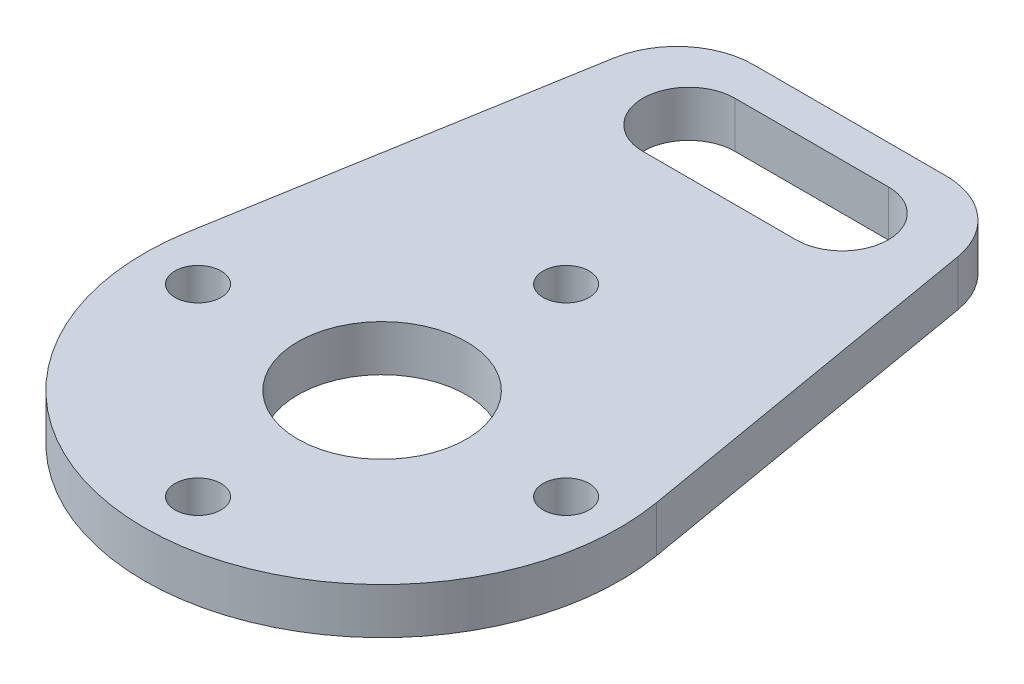
ISO-10303-21;
HEADER;
FILE_DESCRIPTION(('STEP AP214'),'2;1');
FILE_NAME('part.step','',(''),(''),'','','');
FILE_SCHEMA(('AUTOMOTIVE_DESIGN { 1 0 10303 214 1 1 1 1 }'));
ENDSEC;
DATA;
#1=APPLICATION_CONTEXT('core data for automotive mechanical design processes');
#2=APPLICATION_PROTOCOL_DEFINITION('international standard','automotive_design',2000,#1);
#3=PRODUCT_CONTEXT('',#1,'mechanical');
#4=PRODUCT('Part','Part','',(#3));
#5=PRODUCT_RELATED_PRODUCT_CATEGORY('part','',(#4));
#6=PRODUCT_DEFINITION_FORMATION('','',#4);
#7=PRODUCT_DEFINITION_CONTEXT('part definition',#1,'design');
#8=PRODUCT_DEFINITION('design','',#6,#7);
#9=PRODUCT_DEFINITION_SHAPE('','',#8);
#10=(LENGTH_UNIT() NAMED_UNIT(*) SI_UNIT(.MILLI.,.METRE.));
#11=(NAMED_UNIT(*) PLANE_ANGLE_UNIT() SI_UNIT($,.RADIAN.));
#12=(NAMED_UNIT(*) SI_UNIT($,.STERADIAN.) SOLID_ANGLE_UNIT());
#13=UNCERTAINTY_MEASURE_WITH_UNIT(LENGTH_MEASURE(1.E-05),#10,'distance_accuracy_value','');
#14=(GEOMETRIC_REPRESENTATION_CONTEXT(3) GLOBAL_UNCERTAINTY_ASSIGNED_CONTEXT((#13)) GLOBAL_UNIT_ASSIGNED_CONTEXT((#10,
#11,#12)) REPRESENTATION_CONTEXT('',''));
#15=CARTESIAN_POINT('',(0.,0.,0.));
#16=DIRECTION('',(0.,0.,1.));
#17=DIRECTION('',(1.,0.,0.));
#18=AXIS2_PLACEMENT_3D('',#15,#16,#17);
#19=CARTESIAN_POINT('',(0.,-3.,0.));
#20=DIRECTION('',(0.,1.,0.));
#21=DIRECTION('',(0.,0.,1.));
#22=AXIS2_PLACEMENT_3D('',#19,#20,#21);
#23=CYLINDRICAL_SURFACE('',#22,31.);
#24=CARTESIAN_POINT('',(0.,3.,0.));
#25=DIRECTION('',(0.,1.,0.));
#26=DIRECTION('',(0.,0.,1.));
#27=AXIS2_PLACEMENT_3D('',#24,#25,#26);
#28=CIRCLE('',#27,31.);
#29=CARTESIAN_POINT('',(-30.5547397378293,3.,-5.23525353287844));
#30=VERTEX_POINT('',#29);
#31=CARTESIAN_POINT('',(30.5547397378293,3.,-5.23525353287844));
#32=VERTEX_POINT('',#31);
#33=EDGE_CURVE('E224',#30,#32,#28,.T.);
#34=ORIENTED_EDGE('',*,*,#33,.F.);
#35=DIRECTION('',(0.,1.,0.));
#36=VECTOR('',#35,1.);
#37=CARTESIAN_POINT('',(-30.5547397378293,-3.,-5.23525353287844));
#38=LINE('',#37,#36);
#39=CARTESIAN_POINT('',(-30.5547397378293,-3.,-5.23525353287844));
#40=VERTEX_POINT('',#39);
#41=EDGE_CURVE('E375',#40,#30,#38,.T.);
#42=ORIENTED_EDGE('',*,*,#41,.F.);
#43=CARTESIAN_POINT('',(0.,-3.,0.));
#44=DIRECTION('',(0.,1.,0.));
#45=DIRECTION('',(0.,0.,1.));
#46=AXIS2_PLACEMENT_3D('',#43,#44,#45);
#47=CIRCLE('',#46,31.);
#48=CARTESIAN_POINT('',(30.5547397378293,-3.,-5.23525353287844));
#49=VERTEX_POINT('',#48);
#50=EDGE_CURVE('E210',#40,#49,#47,.T.);
#51=ORIENTED_EDGE('',*,*,#50,.T.);
#52=DIRECTION('',(0.,1.,0.));
#53=VECTOR('',#52,1.);
#54=CARTESIAN_POINT('',(30.5547397378293,-3.,-5.23525353287844));
#55=LINE('',#54,#53);
#56=EDGE_CURVE('E367',#49,#32,#55,.T.);
#57=ORIENTED_EDGE('',*,*,#56,.T.);
#58=EDGE_LOOP('',(#34,#42,#51,#57));
#59=FACE_BOUND('',#58,.T.);
#60=ADVANCED_FACE('F54',(#59),#23,.T.);
#61=CARTESIAN_POINT('',(-21.,-3.,-61.));
#62=DIRECTION('',(-0.985636765736428,0.,-0.168879146221885));
#63=DIRECTION('',(-0.168879146221885,0.,0.985636765736429));
#64=AXIS2_PLACEMENT_3D('',#61,#62,#63);
#65=PLANE('',#64);
#66=DIRECTION('',(-0.168879146221885,0.,0.985636765736429));
#67=VECTOR('',#66,1.);
#68=CARTESIAN_POINT('',(-21.,3.,-61.));
#69=LINE('',#68,#67);
#70=CARTESIAN_POINT('',(-22.4240436748357,3.,-52.6887914622188));
#71=VERTEX_POINT('',#70);
#72=EDGE_CURVE('E232',#71,#30,#69,.T.);
#73=ORIENTED_EDGE('',*,*,#72,.F.);
#74=DIRECTION('',(0.,1.,0.));
#75=VECTOR('',#74,1.);
#76=CARTESIAN_POINT('',(-22.4240436748357,-3.,-52.6887914622188));
#77=LINE('',#76,#75);
#78=CARTESIAN_POINT('',(-22.4240436748357,-3.,-52.6887914622188));
#79=VERTEX_POINT('',#78);
#80=EDGE_CURVE('E12',#71,#79,#77,.F.);
#81=ORIENTED_EDGE('',*,*,#80,.T.);
#82=DIRECTION('',(-0.168879146221885,0.,0.985636765736429));
#83=VECTOR('',#82,1.);
#84=CARTESIAN_POINT('',(-21.,-3.,-61.));
#85=LINE('',#84,#83);
#86=EDGE_CURVE('E362',#79,#40,#85,.T.);
#87=ORIENTED_EDGE('',*,*,#86,.T.);
#88=ORIENTED_EDGE('',*,*,#41,.T.);
#89=EDGE_LOOP('',(#73,#81,#87,#88));
#90=FACE_BOUND('',#89,.T.);
#91=ADVANCED_FACE('F312',(#90),#65,.T.);
#92=CARTESIAN_POINT('',(-21.,-3.,-61.));
#93=DIRECTION('',(0.,0.,-1.));
#94=DIRECTION('',(-1.,0.,0.));
#95=AXIS2_PLACEMENT_3D('',#92,#93,#94);
#96=PLANE('',#95);
#97=DIRECTION('',(-1.,0.,0.));
#98=VECTOR('',#97,1.);
#99=CARTESIAN_POINT('',(-21.,3.,-61.));
#100=LINE('',#99,#98);
#101=CARTESIAN_POINT('',(12.5676760174714,3.,-61.));
#102=VERTEX_POINT('',#101);
#103=CARTESIAN_POINT('',(-12.5676760174715,3.,-61.));
#104=VERTEX_POINT('',#103);
#105=EDGE_CURVE('E223',#102,#104,#100,.T.);
#106=ORIENTED_EDGE('',*,*,#105,.F.);
#107=DIRECTION('',(0.,1.,0.));
#108=VECTOR('',#107,1.);
#109=CARTESIAN_POINT('',(12.5676760174715,-3.,-61.));
#110=LINE('',#109,#108);
#111=CARTESIAN_POINT('',(12.5676760174714,-3.,-61.));
#112=VERTEX_POINT('',#111);
#113=EDGE_CURVE('E340',#102,#112,#110,.F.);
#114=ORIENTED_EDGE('',*,*,#113,.T.);
#115=DIRECTION('',(-1.,0.,0.));
#116=VECTOR('',#115,1.);
#117=CARTESIAN_POINT('',(-21.,-3.,-61.));
#118=LINE('',#117,#116);
#119=CARTESIAN_POINT('',(-12.5676760174715,-3.,-61.));
#120=VERTEX_POINT('',#119);
#121=EDGE_CURVE('E360',#112,#120,#118,.T.);
#122=ORIENTED_EDGE('',*,*,#121,.T.);
#123=DIRECTION('',(0.,1.,0.));
#124=VECTOR('',#123,1.);
#125=CARTESIAN_POINT('',(-12.5676760174715,-3.,-61.));
#126=LINE('',#125,#124);
#127=EDGE_CURVE('E349',#120,#104,#126,.T.);
#128=ORIENTED_EDGE('',*,*,#127,.T.);
#129=EDGE_LOOP('',(#106,#114,#122,#128));
#130=FACE_BOUND('',#129,.T.);
#131=ADVANCED_FACE('F319',(#130),#96,.T.);
#132=CARTESIAN_POINT('',(21.,-3.,-61.));
#133=DIRECTION('',(0.985636765736428,0.,-0.168879146221885));
#134=DIRECTION('',(-0.168879146221885,0.,-0.985636765736429));
#135=AXIS2_PLACEMENT_3D('',#132,#133,#134);
#136=PLANE('',#135);
#137=DIRECTION('',(-0.168879146221885,0.,-0.985636765736429));
#138=VECTOR('',#137,1.);
#139=CARTESIAN_POINT('',(21.,-3.,-61.));
#140=LINE('',#139,#138);
#141=CARTESIAN_POINT('',(22.4240436748357,-3.,-52.6887914622188));
#142=VERTEX_POINT('',#141);
#143=EDGE_CURVE('E363',#49,#142,#140,.T.);
#144=ORIENTED_EDGE('',*,*,#143,.T.);
#145=DIRECTION('',(0.,1.,0.));
#146=VECTOR('',#145,1.);
#147=CARTESIAN_POINT('',(22.4240436748357,-3.,-52.6887914622188));
#148=LINE('',#147,#146);
#149=CARTESIAN_POINT('',(22.4240436748357,3.,-52.6887914622188));
#150=VERTEX_POINT('',#149);
#151=EDGE_CURVE('E245',#142,#150,#148,.T.);
#152=ORIENTED_EDGE('',*,*,#151,.T.);
#153=DIRECTION('',(-0.168879146221885,0.,-0.985636765736429));
#154=VECTOR('',#153,1.);
#155=CARTESIAN_POINT('',(21.,3.,-61.));
#156=LINE('',#155,#154);
#157=EDGE_CURVE('E218',#32,#150,#156,.T.);
#158=ORIENTED_EDGE('',*,*,#157,.F.);
#159=ORIENTED_EDGE('',*,*,#56,.F.);
#160=EDGE_LOOP('',(#144,#152,#158,#159));
#161=FACE_BOUND('',#160,.T.);
#162=ADVANCED_FACE('F323',(#161),#136,.T.);
#163=CARTESIAN_POINT('',(0.,-3.,0.));
#164=DIRECTION('',(0.,1.,0.));
#165=DIRECTION('',(0.,0.,1.));
#166=AXIS2_PLACEMENT_3D('',#163,#164,#165);
#167=PLANE('',#166);
#168=CARTESIAN_POINT('',(0.,-3.,-24.));
#169=DIRECTION('',(0.,1.,0.));
#170=DIRECTION('',(0.,0.,1.));
#171=AXIS2_PLACEMENT_3D('',#168,#169,#170);
#172=CIRCLE('',#171,2.99999999999998);
#173=CARTESIAN_POINT('',(0.,-3.,-21.));
#174=VERTEX_POINT('',#173);
#175=EDGE_CURVE('E261',#174,#174,#172,.T.);
#176=ORIENTED_EDGE('',*,*,#175,.T.);
#177=EDGE_LOOP('',(#176));
#178=FACE_BOUND('',#177,.T.);
#179=CARTESIAN_POINT('',(24.,-3.,0.));
#180=DIRECTION('',(0.,1.,0.));
#181=DIRECTION('',(0.,0.,1.));
#182=AXIS2_PLACEMENT_3D('',#179,#180,#181);
#183=CIRCLE('',#182,2.99999999999998);
#184=CARTESIAN_POINT('',(24.,-3.,2.99999999999998));
#185=VERTEX_POINT('',#184);
#186=EDGE_CURVE('E272',#185,#185,#183,.T.);
#187=ORIENTED_EDGE('',*,*,#186,.T.);
#188=EDGE_LOOP('',(#187));
#189=FACE_BOUND('',#188,.T.);
#190=CARTESIAN_POINT('',(0.,-3.,24.));
#191=DIRECTION('',(0.,1.,0.));
#192=DIRECTION('',(0.,0.,1.));
#193=AXIS2_PLACEMENT_3D('',#190,#191,#192);
#194=CIRCLE('',#193,2.99999999999998);
#195=CARTESIAN_POINT('',(0.,-3.,27.));
#196=VERTEX_POINT('',#195);
#197=EDGE_CURVE('E281',#196,#196,#194,.T.);
#198=ORIENTED_EDGE('',*,*,#197,.T.);
#199=EDGE_LOOP('',(#198));
#200=FACE_BOUND('',#199,.T.);
#201=CARTESIAN_POINT('',(-24.,-3.,0.));
#202=DIRECTION('',(0.,1.,0.));
#203=DIRECTION('',(0.,0.,1.));
#204=AXIS2_PLACEMENT_3D('',#201,#202,#203);
#205=CIRCLE('',#204,2.99999999999998);
#206=CARTESIAN_POINT('',(-24.,-3.,2.99999999999998));
#207=VERTEX_POINT('',#206);
#208=EDGE_CURVE('E167',#207,#207,#205,.T.);
#209=ORIENTED_EDGE('',*,*,#208,.T.);
#210=EDGE_LOOP('',(#209));
#211=FACE_BOUND('',#210,.T.);
#212=DIRECTION('',(-1.,0.,0.));
#213=VECTOR('',#212,1.);
#214=CARTESIAN_POINT('',(-10.,-3.,-56.));
#215=LINE('',#214,#213);
#216=CARTESIAN_POINT('',(10.,-3.,-56.));
#217=VERTEX_POINT('',#216);
#218=CARTESIAN_POINT('',(-10.,-3.,-56.));
#219=VERTEX_POINT('',#218);
#220=EDGE_CURVE('E145',#217,#219,#215,.T.);
#221=ORIENTED_EDGE('',*,*,#220,.T.);
#222=CARTESIAN_POINT('',(-10.,-3.,-50.));
#223=DIRECTION('',(0.,1.,0.));
#224=DIRECTION('',(0.,0.,1.));
#225=AXIS2_PLACEMENT_3D('',#222,#223,#224);
#226=CIRCLE('',#225,5.99999999999999);
#227=CARTESIAN_POINT('',(-10.,-3.,-44.));
#228=VERTEX_POINT('',#227);
#229=EDGE_CURVE('E136',#219,#228,#226,.T.);
#230=ORIENTED_EDGE('',*,*,#229,.T.);
#231=DIRECTION('',(1.,0.,0.));
#232=VECTOR('',#231,1.);
#233=CARTESIAN_POINT('',(-10.,-3.,-44.));
#234=LINE('',#233,#232);
#235=CARTESIAN_POINT('',(10.,-3.,-44.));
#236=VERTEX_POINT('',#235);
#237=EDGE_CURVE('E149',#228,#236,#234,.T.);
#238=ORIENTED_EDGE('',*,*,#237,.T.);
#239=CARTESIAN_POINT('',(10.,-3.,-50.));
#240=DIRECTION('',(0.,1.,0.));
#241=DIRECTION('',(0.,0.,1.));
#242=AXIS2_PLACEMENT_3D('',#239,#240,#241);
#243=CIRCLE('',#242,5.99999999999999);
#244=EDGE_CURVE('E154',#236,#217,#243,.T.);
#245=ORIENTED_EDGE('',*,*,#244,.T.);
#246=EDGE_LOOP('',(#221,#230,#238,#245));
#247=FACE_BOUND('',#246,.T.);
#248=CARTESIAN_POINT('',(0.,-3.,0.));
#249=DIRECTION('',(0.,1.,0.));
#250=DIRECTION('',(0.,0.,1.));
#251=AXIS2_PLACEMENT_3D('',#248,#249,#250);
#252=CIRCLE('',#251,11.);
#253=CARTESIAN_POINT('',(0.,-3.,11.));
#254=VERTEX_POINT('',#253);
#255=EDGE_CURVE('E209',#254,#254,#252,.T.);
#256=ORIENTED_EDGE('',*,*,#255,.T.);
#257=EDGE_LOOP('',(#256));
#258=FACE_BOUND('',#257,.T.);
#259=ORIENTED_EDGE('',*,*,#121,.F.);
#260=CARTESIAN_POINT('',(12.5676760174715,-3.,-51.));
#261=DIRECTION('',(0.,1.,0.));
#262=DIRECTION('',(0.,0.,1.));
#263=AXIS2_PLACEMENT_3D('',#260,#261,#262);
#264=CIRCLE('',#263,10.);
#265=EDGE_CURVE('E63',#112,#142,#264,.F.);
#266=ORIENTED_EDGE('',*,*,#265,.T.);
#267=ORIENTED_EDGE('',*,*,#143,.F.);
#268=ORIENTED_EDGE('',*,*,#50,.F.);
#269=ORIENTED_EDGE('',*,*,#86,.F.);
#270=CARTESIAN_POINT('',(-12.5676760174715,-3.,-51.));
#271=DIRECTION('',(0.,1.,0.));
#272=DIRECTION('',(0.,0.,1.));
#273=AXIS2_PLACEMENT_3D('',#270,#271,#272);
#274=CIRCLE('',#273,10.);
#275=EDGE_CURVE('E75',#79,#120,#274,.F.);
#276=ORIENTED_EDGE('',*,*,#275,.T.);
#277=EDGE_LOOP('',(#259,#266,#267,#268,#269,#276));
#278=FACE_BOUND('',#277,.T.);
#279=ADVANCED_FACE('F156',(#178,#189,#200,#211,#247,#258,#278),#167,.F.);
#280=CARTESIAN_POINT('',(0.,3.,0.));
#281=DIRECTION('',(0.,1.,0.));
#282=DIRECTION('',(0.,0.,1.));
#283=AXIS2_PLACEMENT_3D('',#280,#281,#282);
#284=PLANE('',#283);
#285=CARTESIAN_POINT('',(0.,3.,-24.));
#286=DIRECTION('',(0.,1.,0.));
#287=DIRECTION('',(0.,0.,1.));
#288=AXIS2_PLACEMENT_3D('',#285,#286,#287);
#289=CIRCLE('',#288,2.99999999999999);
#290=CARTESIAN_POINT('',(0.,3.,-21.));
#291=VERTEX_POINT('',#290);
#292=EDGE_CURVE('E256',#291,#291,#289,.T.);
#293=ORIENTED_EDGE('',*,*,#292,.F.);
#294=EDGE_LOOP('',(#293));
#295=FACE_BOUND('',#294,.T.);
#296=CARTESIAN_POINT('',(24.,3.,0.));
#297=DIRECTION('',(0.,1.,0.));
#298=DIRECTION('',(0.,0.,1.));
#299=AXIS2_PLACEMENT_3D('',#296,#297,#298);
#300=CIRCLE('',#299,2.99999999999999);
#301=CARTESIAN_POINT('',(24.,3.,2.99999999999999));
#302=VERTEX_POINT('',#301);
#303=EDGE_CURVE('E267',#302,#302,#300,.T.);
#304=ORIENTED_EDGE('',*,*,#303,.F.);
#305=EDGE_LOOP('',(#304));
#306=FACE_BOUND('',#305,.T.);
#307=CARTESIAN_POINT('',(0.,3.,24.));
#308=DIRECTION('',(0.,1.,0.));
#309=DIRECTION('',(0.,0.,1.));
#310=AXIS2_PLACEMENT_3D('',#307,#308,#309);
#311=CIRCLE('',#310,2.99999999999999);
#312=CARTESIAN_POINT('',(0.,3.,27.));
#313=VERTEX_POINT('',#312);
#314=EDGE_CURVE('E276',#313,#313,#311,.T.);
#315=ORIENTED_EDGE('',*,*,#314,.F.);
#316=EDGE_LOOP('',(#315));
#317=FACE_BOUND('',#316,.T.);
#318=CARTESIAN_POINT('',(-24.,3.,0.));
#319=DIRECTION('',(0.,1.,0.));
#320=DIRECTION('',(0.,0.,1.));
#321=AXIS2_PLACEMENT_3D('',#318,#319,#320);
#322=CIRCLE('',#321,2.99999999999999);
#323=CARTESIAN_POINT('',(-24.,3.,2.99999999999999));
#324=VERTEX_POINT('',#323);
#325=EDGE_CURVE('E285',#324,#324,#322,.T.);
#326=ORIENTED_EDGE('',*,*,#325,.F.);
#327=EDGE_LOOP('',(#326));
#328=FACE_BOUND('',#327,.T.);
#329=CARTESIAN_POINT('',(-10.,3.,-50.));
#330=DIRECTION('',(0.,1.,0.));
#331=DIRECTION('',(0.,0.,1.));
#332=AXIS2_PLACEMENT_3D('',#329,#330,#331);
#333=CIRCLE('',#332,5.99999999999999);
#334=CARTESIAN_POINT('',(-10.,3.,-56.));
#335=VERTEX_POINT('',#334);
#336=CARTESIAN_POINT('',(-10.,3.,-44.));
#337=VERTEX_POINT('',#336);
#338=EDGE_CURVE('E139',#335,#337,#333,.T.);
#339=ORIENTED_EDGE('',*,*,#338,.F.);
#340=DIRECTION('',(-1.,0.,0.));
#341=VECTOR('',#340,1.);
#342=CARTESIAN_POINT('',(-10.,3.,-56.));
#343=LINE('',#342,#341);
#344=CARTESIAN_POINT('',(10.,3.,-56.));
#345=VERTEX_POINT('',#344);
#346=EDGE_CURVE('E160',#345,#335,#343,.T.);
#347=ORIENTED_EDGE('',*,*,#346,.F.);
#348=CARTESIAN_POINT('',(10.,3.,-50.));
#349=DIRECTION('',(0.,1.,0.));
#350=DIRECTION('',(0.,0.,1.));
#351=AXIS2_PLACEMENT_3D('',#348,#349,#350);
#352=CIRCLE('',#351,5.99999999999999);
#353=CARTESIAN_POINT('',(10.,3.,-44.));
#354=VERTEX_POINT('',#353);
#355=EDGE_CURVE('E164',#354,#345,#352,.T.);
#356=ORIENTED_EDGE('',*,*,#355,.F.);
#357=DIRECTION('',(1.,0.,0.));
#358=VECTOR('',#357,1.);
#359=CARTESIAN_POINT('',(-10.,3.,-44.));
#360=LINE('',#359,#358);
#361=EDGE_CURVE('E177',#337,#354,#360,.T.);
#362=ORIENTED_EDGE('',*,*,#361,.F.);
#363=EDGE_LOOP('',(#339,#347,#356,#362));
#364=FACE_BOUND('',#363,.T.);
#365=CARTESIAN_POINT('',(0.,3.,0.));
#366=DIRECTION('',(0.,1.,0.));
#367=DIRECTION('',(0.,0.,1.));
#368=AXIS2_PLACEMENT_3D('',#365,#366,#367);
#369=CIRCLE('',#368,11.);
#370=CARTESIAN_POINT('',(0.,3.,11.));
#371=VERTEX_POINT('',#370);
#372=EDGE_CURVE('E203',#371,#371,#369,.T.);
#373=ORIENTED_EDGE('',*,*,#372,.F.);
#374=EDGE_LOOP('',(#373));
#375=FACE_BOUND('',#374,.T.);
#376=ORIENTED_EDGE('',*,*,#157,.T.);
#377=CARTESIAN_POINT('',(12.5676760174715,3.,-51.));
#378=DIRECTION('',(0.,1.,0.));
#379=DIRECTION('',(0.,0.,1.));
#380=AXIS2_PLACEMENT_3D('',#377,#378,#379);
#381=CIRCLE('',#380,10.);
#382=EDGE_CURVE('E244',#150,#102,#381,.T.);
#383=ORIENTED_EDGE('',*,*,#382,.T.);
#384=ORIENTED_EDGE('',*,*,#105,.T.);
#385=CARTESIAN_POINT('',(-12.5676760174715,3.,-51.));
#386=DIRECTION('',(0.,1.,0.));
#387=DIRECTION('',(0.,0.,1.));
#388=AXIS2_PLACEMENT_3D('',#385,#386,#387);
#389=CIRCLE('',#388,10.);
#390=EDGE_CURVE('E240',#104,#71,#389,.T.);
#391=ORIENTED_EDGE('',*,*,#390,.T.);
#392=ORIENTED_EDGE('',*,*,#72,.T.);
#393=ORIENTED_EDGE('',*,*,#33,.T.);
#394=EDGE_LOOP('',(#376,#383,#384,#391,#392,#393));
#395=FACE_BOUND('',#394,.T.);
#396=ADVANCED_FACE('F357',(#295,#306,#317,#328,#364,#375,#395),#284,.T.);
#397=CARTESIAN_POINT('',(0.,-3.,0.));
#398=DIRECTION('',(0.,1.,0.));
#399=DIRECTION('',(0.,0.,1.));
#400=AXIS2_PLACEMENT_3D('',#397,#398,#399);
#401=CYLINDRICAL_SURFACE('',#400,11.);
#402=ORIENTED_EDGE('',*,*,#255,.F.);
#403=EDGE_LOOP('',(#402));
#404=FACE_BOUND('',#403,.T.);
#405=ORIENTED_EDGE('',*,*,#372,.T.);
#406=EDGE_LOOP('',(#405));
#407=FACE_BOUND('',#406,.T.);
#408=ADVANCED_FACE('F382',(#404,#407),#401,.F.);
#409=CARTESIAN_POINT('',(-10.,-3.,-50.));
#410=DIRECTION('',(0.,1.,0.));
#411=DIRECTION('',(0.,0.,1.));
#412=AXIS2_PLACEMENT_3D('',#409,#410,#411);
#413=CYLINDRICAL_SURFACE('',#412,5.99999999999999);
#414=ORIENTED_EDGE('',*,*,#338,.T.);
#415=DIRECTION('',(0.,1.,0.));
#416=VECTOR('',#415,1.);
#417=CARTESIAN_POINT('',(-10.,-3.,-44.));
#418=LINE('',#417,#416);
#419=EDGE_CURVE('E132',#228,#337,#418,.T.);
#420=ORIENTED_EDGE('',*,*,#419,.F.);
#421=ORIENTED_EDGE('',*,*,#229,.F.);
#422=DIRECTION('',(0.,1.,0.));
#423=VECTOR('',#422,1.);
#424=CARTESIAN_POINT('',(-10.,-3.,-56.));
#425=LINE('',#424,#423);
#426=EDGE_CURVE('E193',#219,#335,#425,.T.);
#427=ORIENTED_EDGE('',*,*,#426,.T.);
#428=EDGE_LOOP('',(#414,#420,#421,#427));
#429=FACE_BOUND('',#428,.T.);
#430=ADVANCED_FACE('F134',(#429),#413,.F.);
#431=CARTESIAN_POINT('',(-10.,-3.,-56.));
#432=DIRECTION('',(0.,0.,-1.));
#433=DIRECTION('',(-1.,0.,0.));
#434=AXIS2_PLACEMENT_3D('',#431,#432,#433);
#435=PLANE('',#434);
#436=ORIENTED_EDGE('',*,*,#346,.T.);
#437=ORIENTED_EDGE('',*,*,#426,.F.);
#438=ORIENTED_EDGE('',*,*,#220,.F.);
#439=DIRECTION('',(0.,1.,0.));
#440=VECTOR('',#439,1.);
#441=CARTESIAN_POINT('',(10.,-3.,-56.));
#442=LINE('',#441,#440);
#443=EDGE_CURVE('E519',#217,#345,#442,.T.);
#444=ORIENTED_EDGE('',*,*,#443,.T.);
#445=EDGE_LOOP('',(#436,#437,#438,#444));
#446=FACE_BOUND('',#445,.T.);
#447=ADVANCED_FACE('F427',(#446),#435,.F.);
#448=CARTESIAN_POINT('',(10.,-3.,-50.));
#449=DIRECTION('',(0.,1.,0.));
#450=DIRECTION('',(0.,0.,1.));
#451=AXIS2_PLACEMENT_3D('',#448,#449,#450);
#452=CYLINDRICAL_SURFACE('',#451,5.99999999999999);
#453=ORIENTED_EDGE('',*,*,#355,.T.);
#454=ORIENTED_EDGE('',*,*,#443,.F.);
#455=ORIENTED_EDGE('',*,*,#244,.F.);
#456=DIRECTION('',(0.,1.,0.));
#457=VECTOR('',#456,1.);
#458=CARTESIAN_POINT('',(10.,-3.,-44.));
#459=LINE('',#458,#457);
#460=EDGE_CURVE('E144',#236,#354,#459,.T.);
#461=ORIENTED_EDGE('',*,*,#460,.T.);
#462=EDGE_LOOP('',(#453,#454,#455,#461));
#463=FACE_BOUND('',#462,.T.);
#464=ADVANCED_FACE('F308',(#463),#452,.F.);
#465=CARTESIAN_POINT('',(-10.,-3.,-44.));
#466=DIRECTION('',(0.,0.,1.));
#467=DIRECTION('',(1.,0.,0.));
#468=AXIS2_PLACEMENT_3D('',#465,#466,#467);
#469=PLANE('',#468);
#470=ORIENTED_EDGE('',*,*,#361,.T.);
#471=ORIENTED_EDGE('',*,*,#460,.F.);
#472=ORIENTED_EDGE('',*,*,#237,.F.);
#473=ORIENTED_EDGE('',*,*,#419,.T.);
#474=EDGE_LOOP('',(#470,#471,#472,#473));
#475=FACE_BOUND('',#474,.T.);
#476=ADVANCED_FACE('F150',(#475),#469,.F.);
#477=CARTESIAN_POINT('',(-24.,3.,0.));
#478=DIRECTION('',(0.,1.,0.));
#479=DIRECTION('',(0.,0.,1.));
#480=AXIS2_PLACEMENT_3D('',#477,#478,#479);
#481=CYLINDRICAL_SURFACE('',#480,2.99999999999998);
#482=ORIENTED_EDGE('',*,*,#325,.T.);
#483=EDGE_LOOP('',(#482));
#484=FACE_BOUND('',#483,.T.);
#485=ORIENTED_EDGE('',*,*,#208,.F.);
#486=EDGE_LOOP('',(#485));
#487=FACE_BOUND('',#486,.T.);
#488=ADVANCED_FACE('F297',(#484,#487),#481,.F.);
#489=CARTESIAN_POINT('',(0.,3.,24.));
#490=DIRECTION('',(0.,1.,0.));
#491=DIRECTION('',(0.,0.,1.));
#492=AXIS2_PLACEMENT_3D('',#489,#490,#491);
#493=CYLINDRICAL_SURFACE('',#492,2.99999999999998);
#494=ORIENTED_EDGE('',*,*,#314,.T.);
#495=EDGE_LOOP('',(#494));
#496=FACE_BOUND('',#495,.T.);
#497=ORIENTED_EDGE('',*,*,#197,.F.);
#498=EDGE_LOOP('',(#497));
#499=FACE_BOUND('',#498,.T.);
#500=ADVANCED_FACE('F299',(#496,#499),#493,.F.);
#501=CARTESIAN_POINT('',(24.,3.,0.));
#502=DIRECTION('',(0.,1.,0.));
#503=DIRECTION('',(0.,0.,1.));
#504=AXIS2_PLACEMENT_3D('',#501,#502,#503);
#505=CYLINDRICAL_SURFACE('',#504,2.99999999999998);
#506=ORIENTED_EDGE('',*,*,#303,.T.);
#507=EDGE_LOOP('',(#506));
#508=FACE_BOUND('',#507,.T.);
#509=ORIENTED_EDGE('',*,*,#186,.F.);
#510=EDGE_LOOP('',(#509));
#511=FACE_BOUND('',#510,.T.);
#512=ADVANCED_FACE('F305',(#508,#511),#505,.F.);
#513=CARTESIAN_POINT('',(0.,3.,-24.));
#514=DIRECTION('',(0.,1.,0.));
#515=DIRECTION('',(0.,0.,1.));
#516=AXIS2_PLACEMENT_3D('',#513,#514,#515);
#517=CYLINDRICAL_SURFACE('',#516,2.99999999999998);
#518=ORIENTED_EDGE('',*,*,#292,.T.);
#519=EDGE_LOOP('',(#518));
#520=FACE_BOUND('',#519,.T.);
#521=ORIENTED_EDGE('',*,*,#175,.F.);
#522=EDGE_LOOP('',(#521));
#523=FACE_BOUND('',#522,.T.);
#524=ADVANCED_FACE('F327',(#520,#523),#517,.F.);
#525=CARTESIAN_POINT('',(12.5676760174715,-3.,-51.));
#526=DIRECTION('',(0.,1.,0.));
#527=DIRECTION('',(0.,0.,1.));
#528=AXIS2_PLACEMENT_3D('',#525,#526,#527);
#529=CYLINDRICAL_SURFACE('',#528,10.);
#530=ORIENTED_EDGE('',*,*,#265,.F.);
#531=ORIENTED_EDGE('',*,*,#113,.F.);
#532=ORIENTED_EDGE('',*,*,#382,.F.);
#533=ORIENTED_EDGE('',*,*,#151,.F.);
#534=EDGE_LOOP('',(#530,#531,#532,#533));
#535=FACE_BOUND('',#534,.T.);
#536=ADVANCED_FACE('F325',(#535),#529,.T.);
#537=CARTESIAN_POINT('',(-12.5676760174715,-3.,-51.));
#538=DIRECTION('',(0.,1.,0.));
#539=DIRECTION('',(0.,0.,1.));
#540=AXIS2_PLACEMENT_3D('',#537,#538,#539);
#541=CYLINDRICAL_SURFACE('',#540,10.);
#542=ORIENTED_EDGE('',*,*,#275,.F.);
#543=ORIENTED_EDGE('',*,*,#80,.F.);
#544=ORIENTED_EDGE('',*,*,#390,.F.);
#545=ORIENTED_EDGE('',*,*,#127,.F.);
#546=EDGE_LOOP('',(#542,#543,#544,#545));
#547=FACE_BOUND('',#546,.T.);
#548=ADVANCED_FACE('F56',(#547),#541,.T.);
#549=CLOSED_SHELL('',(#60,#91,#131,#162,#279,#396,#408,#430,#447,#464,#476,#488,#500,#512,#524,
#536,#548));
#550=MANIFOLD_SOLID_BREP('B2',#549);
#551=ADVANCED_BREP_SHAPE_REPRESENTATION('',(#18,#550),#14);
#552=SHAPE_DEFINITION_REPRESENTATION(#9,#551);
ENDSEC;
END-ISO-10303-21;
